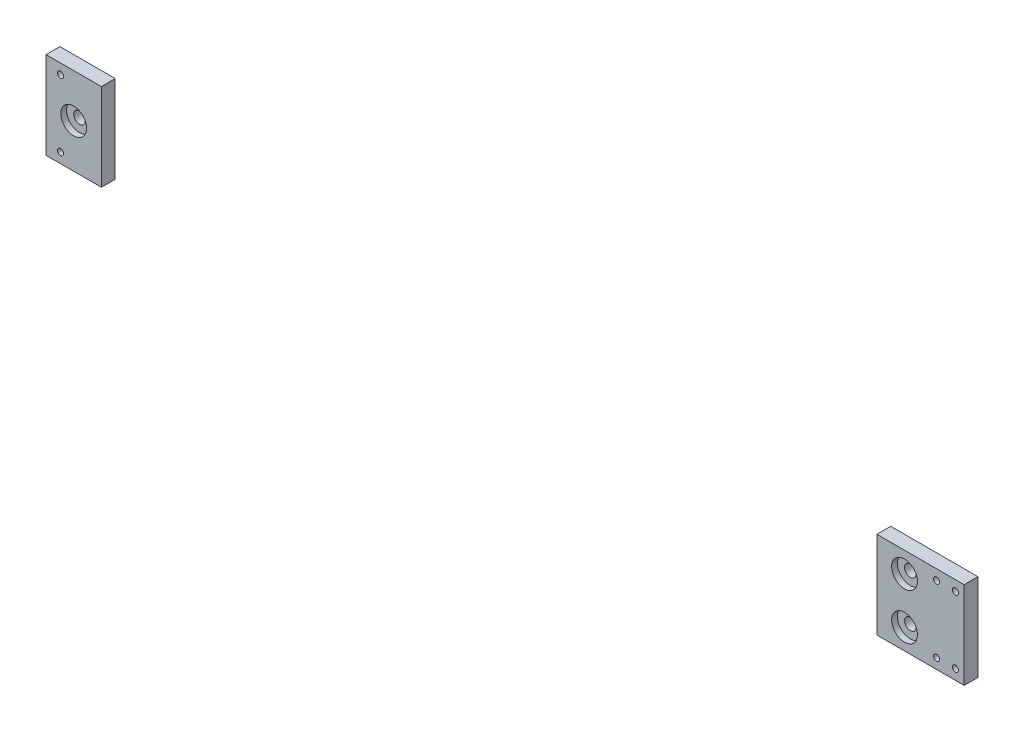
ISO-10303-21;
HEADER;
FILE_DESCRIPTION(('STEP AP214'),'2;1');
FILE_NAME('part.step','',(''),(''),'','','');
FILE_SCHEMA(('AUTOMOTIVE_DESIGN { 1 0 10303 214 1 1 1 1 }'));
ENDSEC;
DATA;
#1=APPLICATION_CONTEXT('core data for automotive mechanical design processes');
#2=APPLICATION_PROTOCOL_DEFINITION('international standard','automotive_design',2000,#1);
#3=PRODUCT_CONTEXT('',#1,'mechanical');
#4=PRODUCT('Part','Part','',(#3));
#5=PRODUCT_RELATED_PRODUCT_CATEGORY('part','',(#4));
#6=PRODUCT_DEFINITION_FORMATION('','',#4);
#7=PRODUCT_DEFINITION_CONTEXT('part definition',#1,'design');
#8=PRODUCT_DEFINITION('design','',#6,#7);
#9=PRODUCT_DEFINITION_SHAPE('','',#8);
#10=(LENGTH_UNIT() NAMED_UNIT(*) SI_UNIT(.MILLI.,.METRE.));
#11=(NAMED_UNIT(*) PLANE_ANGLE_UNIT() SI_UNIT($,.RADIAN.));
#12=(NAMED_UNIT(*) SI_UNIT($,.STERADIAN.) SOLID_ANGLE_UNIT());
#13=UNCERTAINTY_MEASURE_WITH_UNIT(LENGTH_MEASURE(1.E-05),#10,'distance_accuracy_value','');
#14=(GEOMETRIC_REPRESENTATION_CONTEXT(3) GLOBAL_UNCERTAINTY_ASSIGNED_CONTEXT((#13)) GLOBAL_UNIT_ASSIGNED_CONTEXT((#10,
#11,#12)) REPRESENTATION_CONTEXT('',''));
#15=CARTESIAN_POINT('',(0.,0.,0.));
#16=DIRECTION('',(0.,0.,1.));
#17=DIRECTION('',(1.,0.,0.));
#18=AXIS2_PLACEMENT_3D('',#15,#16,#17);
#19=CARTESIAN_POINT('',(295.275,-15.875,0.00102977183991798));
#20=DIRECTION('',(0.,0.,1.));
#21=DIRECTION('',(1.,0.,0.));
#22=AXIS2_PLACEMENT_3D('',#19,#20,#21);
#23=CYLINDRICAL_SURFACE('',#22,3.96875000000005);
#24=CARTESIAN_POINT('',(295.275,-15.875,0.00102977183991798));
#25=DIRECTION('',(0.,0.,1.));
#26=DIRECTION('',(1.,0.,0.));
#27=AXIS2_PLACEMENT_3D('',#24,#25,#26);
#28=CIRCLE('',#27,3.96875000000005);
#29=CARTESIAN_POINT('',(299.24375,-15.875,0.00102977183991798));
#30=VERTEX_POINT('',#29);
#31=EDGE_CURVE('E152',#30,#30,#28,.F.);
#32=CARTESIAN_POINT('',(295.275,-15.875,5.55854977183992));
#33=DIRECTION('',(0.,0.,1.));
#34=DIRECTION('',(1.,0.,0.));
#35=AXIS2_PLACEMENT_3D('',#32,#33,#34);
#36=CIRCLE('',#35,3.96875000000005);
#37=CARTESIAN_POINT('',(299.24375,-15.875,5.55854977183992));
#38=VERTEX_POINT('',#37);
#39=EDGE_CURVE('E158',#38,#38,#36,.F.);
#40=CARTESIAN_POINT('',(299.24375,-15.875,0.00102977183991798));
#41=CARTESIAN_POINT('',(299.24375,-15.875,0.0589206051732512));
#42=CARTESIAN_POINT('',(299.24375,-15.875,0.116811438506585));
#43=CARTESIAN_POINT('',(299.24375,-15.875,0.232593105173251));
#44=CARTESIAN_POINT('',(299.24375,-15.875,0.290483938506585));
#45=CARTESIAN_POINT('',(299.24375,-15.875,0.406265605173251));
#46=CARTESIAN_POINT('',(299.24375,-15.875,0.464156438506585));
#47=CARTESIAN_POINT('',(299.24375,-15.875,0.579938105173251));
#48=CARTESIAN_POINT('',(299.24375,-15.875,0.637828938506585));
#49=CARTESIAN_POINT('',(299.24375,-15.875,0.753610605173251));
#50=CARTESIAN_POINT('',(299.24375,-15.875,0.811501438506585));
#51=CARTESIAN_POINT('',(299.24375,-15.875,0.927283105173251));
#52=CARTESIAN_POINT('',(299.24375,-15.875,0.985173938506585));
#53=CARTESIAN_POINT('',(299.24375,-15.875,1.10095560517325));
#54=CARTESIAN_POINT('',(299.24375,-15.875,1.15884643850658));
#55=CARTESIAN_POINT('',(299.24375,-15.875,1.27462810517325));
#56=CARTESIAN_POINT('',(299.24375,-15.875,1.33251893850658));
#57=CARTESIAN_POINT('',(299.24375,-15.875,1.44830060517325));
#58=CARTESIAN_POINT('',(299.24375,-15.875,1.50619143850658));
#59=CARTESIAN_POINT('',(299.24375,-15.875,1.62197310517325));
#60=CARTESIAN_POINT('',(299.24375,-15.875,1.67986393850658));
#61=CARTESIAN_POINT('',(299.24375,-15.875,1.79564560517325));
#62=CARTESIAN_POINT('',(299.24375,-15.875,1.85353643850658));
#63=CARTESIAN_POINT('',(299.24375,-15.875,1.96931810517325));
#64=CARTESIAN_POINT('',(299.24375,-15.875,2.02720893850658));
#65=CARTESIAN_POINT('',(299.24375,-15.875,2.14299060517325));
#66=CARTESIAN_POINT('',(299.24375,-15.875,2.20088143850658));
#67=CARTESIAN_POINT('',(299.24375,-15.875,2.31666310517325));
#68=CARTESIAN_POINT('',(299.24375,-15.875,2.37455393850658));
#69=CARTESIAN_POINT('',(299.24375,-15.875,2.49033560517325));
#70=CARTESIAN_POINT('',(299.24375,-15.875,2.54822643850658));
#71=CARTESIAN_POINT('',(299.24375,-15.875,2.66400810517325));
#72=CARTESIAN_POINT('',(299.24375,-15.875,2.72189893850658));
#73=CARTESIAN_POINT('',(299.24375,-15.875,2.83768060517325));
#74=CARTESIAN_POINT('',(299.24375,-15.875,2.89557143850658));
#75=CARTESIAN_POINT('',(299.24375,-15.875,3.01135310517325));
#76=CARTESIAN_POINT('',(299.24375,-15.875,3.06924393850658));
#77=CARTESIAN_POINT('',(299.24375,-15.875,3.18502560517325));
#78=CARTESIAN_POINT('',(299.24375,-15.875,3.24291643850658));
#79=CARTESIAN_POINT('',(299.24375,-15.875,3.35869810517325));
#80=CARTESIAN_POINT('',(299.24375,-15.875,3.41658893850658));
#81=CARTESIAN_POINT('',(299.24375,-15.875,3.53237060517325));
#82=CARTESIAN_POINT('',(299.24375,-15.875,3.59026143850658));
#83=CARTESIAN_POINT('',(299.24375,-15.875,3.70604310517325));
#84=CARTESIAN_POINT('',(299.24375,-15.875,3.76393393850658));
#85=CARTESIAN_POINT('',(299.24375,-15.875,3.87971560517325));
#86=CARTESIAN_POINT('',(299.24375,-15.875,3.93760643850658));
#87=CARTESIAN_POINT('',(299.24375,-15.875,4.05338810517325));
#88=CARTESIAN_POINT('',(299.24375,-15.875,4.11127893850658));
#89=CARTESIAN_POINT('',(299.24375,-15.875,4.22706060517325));
#90=CARTESIAN_POINT('',(299.24375,-15.875,4.28495143850658));
#91=CARTESIAN_POINT('',(299.24375,-15.875,4.40073310517325));
#92=CARTESIAN_POINT('',(299.24375,-15.875,4.45862393850658));
#93=CARTESIAN_POINT('',(299.24375,-15.875,4.57440560517325));
#94=CARTESIAN_POINT('',(299.24375,-15.875,4.63229643850658));
#95=CARTESIAN_POINT('',(299.24375,-15.875,4.74807810517325));
#96=CARTESIAN_POINT('',(299.24375,-15.875,4.80596893850658));
#97=CARTESIAN_POINT('',(299.24375,-15.875,4.92175060517325));
#98=CARTESIAN_POINT('',(299.24375,-15.875,4.97964143850658));
#99=CARTESIAN_POINT('',(299.24375,-15.875,5.09542310517325));
#100=CARTESIAN_POINT('',(299.24375,-15.875,5.15331393850658));
#101=CARTESIAN_POINT('',(299.24375,-15.875,5.26909560517325));
#102=CARTESIAN_POINT('',(299.24375,-15.875,5.32698643850658));
#103=CARTESIAN_POINT('',(299.24375,-15.875,5.44276810517325));
#104=CARTESIAN_POINT('',(299.24375,-15.875,5.50065893850658));
#105=CARTESIAN_POINT('',(299.24375,-15.875,5.55854977183992));
#106=B_SPLINE_CURVE_WITH_KNOTS('',3,(#40,#41,#42,#43,#44,#45,#46,#47,#48,#49,#50,#51,#52,#53,
#54,#55,#56,#57,#58,#59,#60,#61,#62,#63,#64,#65,#66,#67,#68,#69,#70,#71,#72,#73,#74,#75,#76,#77,
#78,#79,#80,#81,#82,#83,#84,#85,#86,#87,#88,#89,#90,#91,#92,#93,#94,#95,#96,#97,#98,#99,#100,
#101,#102,#103,#104,#105),.UNSPECIFIED.,.F.,.F.,(4,2,2,2,2,2,2,2,2,2,2,2,2,2,2,2,2,2,2,2,2,2,2,
2,2,2,2,2,2,2,2,2,4),(0.,0.1736725,0.347345,0.5210175,0.69469,0.8683625,1.042035,1.2157075,
1.38938,1.5630525,1.736725,1.9103975,2.08407,2.2577425,2.431415,2.6050875,2.77876,2.9524325,
3.126105,3.2997775,3.47345,3.6471225,3.820795,3.9944675,4.16814,4.3418125,4.515485,4.6891575,
4.86283,5.0365025,5.210175,5.3838475,5.55752),.UNSPECIFIED.);
#107=EDGE_CURVE('BSEAM55',#30,#38,#106,.T.);
#108=ORIENTED_EDGE('',*,*,#31,.T.);
#109=ORIENTED_EDGE('',*,*,#39,.F.);
#110=ORIENTED_EDGE('',*,*,#107,.T.);
#111=ORIENTED_EDGE('',*,*,#107,.F.);
#112=EDGE_LOOP('',(#108,#110,#109,#111));
#113=FACE_BOUND('',#112,.T.);
#114=ADVANCED_FACE('F55',(#113),#23,.F.);
#115=CARTESIAN_POINT('',(295.275,15.875,0.00102977183991798));
#116=DIRECTION('',(0.,0.,1.));
#117=DIRECTION('',(1.,0.,0.));
#118=AXIS2_PLACEMENT_3D('',#115,#116,#117);
#119=CYLINDRICAL_SURFACE('',#118,3.96875000000005);
#120=CARTESIAN_POINT('',(295.275,15.875,0.00102977183991798));
#121=DIRECTION('',(0.,0.,1.));
#122=DIRECTION('',(1.,0.,0.));
#123=AXIS2_PLACEMENT_3D('',#120,#121,#122);
#124=CIRCLE('',#123,3.96875000000005);
#125=CARTESIAN_POINT('',(299.24375,15.875,0.00102977183991798));
#126=VERTEX_POINT('',#125);
#127=EDGE_CURVE('E141',#126,#126,#124,.T.);
#128=CARTESIAN_POINT('',(295.275,15.875,5.55854977183992));
#129=DIRECTION('',(0.,0.,1.));
#130=DIRECTION('',(1.,0.,0.));
#131=AXIS2_PLACEMENT_3D('',#128,#129,#130);
#132=CIRCLE('',#131,3.96875000000005);
#133=CARTESIAN_POINT('',(299.24375,15.875,5.55854977183992));
#134=VERTEX_POINT('',#133);
#135=EDGE_CURVE('E155',#134,#134,#132,.F.);
#136=CARTESIAN_POINT('',(299.24375,15.875,0.00102977183991798));
#137=CARTESIAN_POINT('',(299.24375,15.875,0.0589206051732512));
#138=CARTESIAN_POINT('',(299.24375,15.875,0.116811438506585));
#139=CARTESIAN_POINT('',(299.24375,15.875,0.232593105173251));
#140=CARTESIAN_POINT('',(299.24375,15.875,0.290483938506585));
#141=CARTESIAN_POINT('',(299.24375,15.875,0.406265605173251));
#142=CARTESIAN_POINT('',(299.24375,15.875,0.464156438506585));
#143=CARTESIAN_POINT('',(299.24375,15.875,0.579938105173251));
#144=CARTESIAN_POINT('',(299.24375,15.875,0.637828938506585));
#145=CARTESIAN_POINT('',(299.24375,15.875,0.753610605173251));
#146=CARTESIAN_POINT('',(299.24375,15.875,0.811501438506585));
#147=CARTESIAN_POINT('',(299.24375,15.875,0.927283105173251));
#148=CARTESIAN_POINT('',(299.24375,15.875,0.985173938506585));
#149=CARTESIAN_POINT('',(299.24375,15.875,1.10095560517325));
#150=CARTESIAN_POINT('',(299.24375,15.875,1.15884643850658));
#151=CARTESIAN_POINT('',(299.24375,15.875,1.27462810517325));
#152=CARTESIAN_POINT('',(299.24375,15.875,1.33251893850658));
#153=CARTESIAN_POINT('',(299.24375,15.875,1.44830060517325));
#154=CARTESIAN_POINT('',(299.24375,15.875,1.50619143850658));
#155=CARTESIAN_POINT('',(299.24375,15.875,1.62197310517325));
#156=CARTESIAN_POINT('',(299.24375,15.875,1.67986393850658));
#157=CARTESIAN_POINT('',(299.24375,15.875,1.79564560517325));
#158=CARTESIAN_POINT('',(299.24375,15.875,1.85353643850658));
#159=CARTESIAN_POINT('',(299.24375,15.875,1.96931810517325));
#160=CARTESIAN_POINT('',(299.24375,15.875,2.02720893850658));
#161=CARTESIAN_POINT('',(299.24375,15.875,2.14299060517325));
#162=CARTESIAN_POINT('',(299.24375,15.875,2.20088143850658));
#163=CARTESIAN_POINT('',(299.24375,15.875,2.31666310517325));
#164=CARTESIAN_POINT('',(299.24375,15.875,2.37455393850658));
#165=CARTESIAN_POINT('',(299.24375,15.875,2.49033560517325));
#166=CARTESIAN_POINT('',(299.24375,15.875,2.54822643850658));
#167=CARTESIAN_POINT('',(299.24375,15.875,2.66400810517325));
#168=CARTESIAN_POINT('',(299.24375,15.875,2.72189893850658));
#169=CARTESIAN_POINT('',(299.24375,15.875,2.83768060517325));
#170=CARTESIAN_POINT('',(299.24375,15.875,2.89557143850658));
#171=CARTESIAN_POINT('',(299.24375,15.875,3.01135310517325));
#172=CARTESIAN_POINT('',(299.24375,15.875,3.06924393850658));
#173=CARTESIAN_POINT('',(299.24375,15.875,3.18502560517325));
#174=CARTESIAN_POINT('',(299.24375,15.875,3.24291643850658));
#175=CARTESIAN_POINT('',(299.24375,15.875,3.35869810517325));
#176=CARTESIAN_POINT('',(299.24375,15.875,3.41658893850658));
#177=CARTESIAN_POINT('',(299.24375,15.875,3.53237060517325));
#178=CARTESIAN_POINT('',(299.24375,15.875,3.59026143850658));
#179=CARTESIAN_POINT('',(299.24375,15.875,3.70604310517325));
#180=CARTESIAN_POINT('',(299.24375,15.875,3.76393393850658));
#181=CARTESIAN_POINT('',(299.24375,15.875,3.87971560517325));
#182=CARTESIAN_POINT('',(299.24375,15.875,3.93760643850658));
#183=CARTESIAN_POINT('',(299.24375,15.875,4.05338810517325));
#184=CARTESIAN_POINT('',(299.24375,15.875,4.11127893850658));
#185=CARTESIAN_POINT('',(299.24375,15.875,4.22706060517325));
#186=CARTESIAN_POINT('',(299.24375,15.875,4.28495143850658));
#187=CARTESIAN_POINT('',(299.24375,15.875,4.40073310517325));
#188=CARTESIAN_POINT('',(299.24375,15.875,4.45862393850658));
#189=CARTESIAN_POINT('',(299.24375,15.875,4.57440560517325));
#190=CARTESIAN_POINT('',(299.24375,15.875,4.63229643850658));
#191=CARTESIAN_POINT('',(299.24375,15.875,4.74807810517325));
#192=CARTESIAN_POINT('',(299.24375,15.875,4.80596893850658));
#193=CARTESIAN_POINT('',(299.24375,15.875,4.92175060517325));
#194=CARTESIAN_POINT('',(299.24375,15.875,4.97964143850658));
#195=CARTESIAN_POINT('',(299.24375,15.875,5.09542310517325));
#196=CARTESIAN_POINT('',(299.24375,15.875,5.15331393850658));
#197=CARTESIAN_POINT('',(299.24375,15.875,5.26909560517325));
#198=CARTESIAN_POINT('',(299.24375,15.875,5.32698643850658));
#199=CARTESIAN_POINT('',(299.24375,15.875,5.44276810517325));
#200=CARTESIAN_POINT('',(299.24375,15.875,5.50065893850658));
#201=CARTESIAN_POINT('',(299.24375,15.875,5.55854977183992));
#202=B_SPLINE_CURVE_WITH_KNOTS('',3,(#136,#137,#138,#139,#140,#141,#142,#143,#144,#145,#146,
#147,#148,#149,#150,#151,#152,#153,#154,#155,#156,#157,#158,#159,#160,#161,#162,#163,#164,#165,
#166,#167,#168,#169,#170,#171,#172,#173,#174,#175,#176,#177,#178,#179,#180,#181,#182,#183,#184,
#185,#186,#187,#188,#189,#190,#191,#192,#193,#194,#195,#196,#197,#198,#199,#200,#201),
.UNSPECIFIED.,.F.,.F.,(4,2,2,2,2,2,2,2,2,2,2,2,2,2,2,2,2,2,2,2,2,2,2,2,2,2,2,2,2,2,2,2,4),(0.,
0.1736725,0.347345,0.5210175,0.69469,0.8683625,1.042035,1.2157075,1.38938,1.5630525,1.736725,
1.9103975,2.08407,2.2577425,2.431415,2.6050875,2.77876,2.9524325,3.126105,3.2997775,3.47345,
3.6471225,3.820795,3.9944675,4.16814,4.3418125,4.515485,4.6891575,4.86283,5.0365025,5.210175,
5.3838475,5.55752),.UNSPECIFIED.);
#203=EDGE_CURVE('BSEAM189',#126,#134,#202,.T.);
#204=ORIENTED_EDGE('',*,*,#127,.F.);
#205=ORIENTED_EDGE('',*,*,#135,.F.);
#206=ORIENTED_EDGE('',*,*,#203,.T.);
#207=ORIENTED_EDGE('',*,*,#203,.F.);
#208=EDGE_LOOP('',(#204,#206,#205,#207));
#209=FACE_BOUND('',#208,.T.);
#210=ADVANCED_FACE('F189',(#209),#119,.F.);
#211=CARTESIAN_POINT('',(0.,0.,0.00102977183991798));
#212=DIRECTION('',(0.,0.,1.));
#213=DIRECTION('',(1.,0.,0.));
#214=AXIS2_PLACEMENT_3D('',#211,#212,#213);
#215=PLANE('',#214);
#216=DIRECTION('',(1.,0.,0.));
#217=VECTOR('',#216,1.);
#218=CARTESIAN_POINT('',(0.,29.9999999999998,0.00102977183991798));
#219=LINE('',#218,#217);
#220=CARTESIAN_POINT('',(276.236980653398,30.,0.00102977183991798));
#221=VERTEX_POINT('',#220);
#222=CARTESIAN_POINT('',(336.274999942,30.,0.00102977183991798));
#223=VERTEX_POINT('',#222);
#224=EDGE_CURVE('E111',#221,#223,#219,.T.);
#225=ORIENTED_EDGE('',*,*,#224,.T.);
#226=DIRECTION('',(0.,-1.,0.));
#227=VECTOR('',#226,1.);
#228=CARTESIAN_POINT('',(336.274999942,30.,0.00102977183991798));
#229=LINE('',#228,#227);
#230=CARTESIAN_POINT('',(336.274999942,-29.9999999999999,0.00102977183991798));
#231=VERTEX_POINT('',#230);
#232=EDGE_CURVE('E70',#223,#231,#229,.T.);
#233=ORIENTED_EDGE('',*,*,#232,.T.);
#234=DIRECTION('',(1.,0.,0.));
#235=VECTOR('',#234,1.);
#236=CARTESIAN_POINT('',(0.,-30.,0.00102977183991798));
#237=LINE('',#236,#235);
#238=CARTESIAN_POINT('',(276.236980653398,-30.,0.00102977183991798));
#239=VERTEX_POINT('',#238);
#240=EDGE_CURVE('E109',#239,#231,#237,.T.);
#241=ORIENTED_EDGE('',*,*,#240,.F.);
#242=DIRECTION('',(0.,-1.,0.));
#243=VECTOR('',#242,1.);
#244=CARTESIAN_POINT('',(276.236980653398,0.,0.00102977183991798));
#245=LINE('',#244,#243);
#246=EDGE_CURVE('E114',#221,#239,#245,.T.);
#247=ORIENTED_EDGE('',*,*,#246,.F.);
#248=EDGE_LOOP('',(#225,#233,#241,#247));
#249=FACE_BOUND('',#248,.T.);
#250=CARTESIAN_POINT('',(317.274999942,23.,0.00102977183991798));
#251=DIRECTION('',(0.,0.,1.));
#252=DIRECTION('',(1.,0.,0.));
#253=AXIS2_PLACEMENT_3D('',#250,#251,#252);
#254=CIRCLE('',#253,2.09999999999999);
#255=CARTESIAN_POINT('',(319.374999942,23.,0.00102977183991798));
#256=VERTEX_POINT('',#255);
#257=EDGE_CURVE('E127',#256,#256,#254,.F.);
#258=ORIENTED_EDGE('',*,*,#257,.F.);
#259=EDGE_LOOP('',(#258));
#260=FACE_BOUND('',#259,.T.);
#261=CARTESIAN_POINT('',(330.274999942,23.,0.00102977183991798));
#262=DIRECTION('',(0.,0.,1.));
#263=DIRECTION('',(1.,0.,0.));
#264=AXIS2_PLACEMENT_3D('',#261,#262,#263);
#265=CIRCLE('',#264,2.09999999999999);
#266=CARTESIAN_POINT('',(332.374999942,23.,0.00102977183991798));
#267=VERTEX_POINT('',#266);
#268=EDGE_CURVE('E145',#267,#267,#265,.F.);
#269=ORIENTED_EDGE('',*,*,#268,.F.);
#270=EDGE_LOOP('',(#269));
#271=FACE_BOUND('',#270,.T.);
#272=CARTESIAN_POINT('',(330.274999942,-23.,0.00102977183991798));
#273=DIRECTION('',(0.,0.,1.));
#274=DIRECTION('',(1.,0.,0.));
#275=AXIS2_PLACEMENT_3D('',#272,#273,#274);
#276=CIRCLE('',#275,2.09999999999999);
#277=CARTESIAN_POINT('',(332.374999942,-23.,0.00102977183991798));
#278=VERTEX_POINT('',#277);
#279=EDGE_CURVE('E137',#278,#278,#276,.F.);
#280=ORIENTED_EDGE('',*,*,#279,.F.);
#281=EDGE_LOOP('',(#280));
#282=FACE_BOUND('',#281,.T.);
#283=CARTESIAN_POINT('',(317.274999942,-23.,0.00102977183991798));
#284=DIRECTION('',(0.,0.,1.));
#285=DIRECTION('',(1.,0.,0.));
#286=AXIS2_PLACEMENT_3D('',#283,#284,#285);
#287=CIRCLE('',#286,2.09999999999999);
#288=CARTESIAN_POINT('',(319.374999942,-23.,0.00102977183991798));
#289=VERTEX_POINT('',#288);
#290=EDGE_CURVE('E138',#289,#289,#287,.F.);
#291=ORIENTED_EDGE('',*,*,#290,.F.);
#292=EDGE_LOOP('',(#291));
#293=FACE_BOUND('',#292,.T.);
#294=ORIENTED_EDGE('',*,*,#31,.F.);
#295=EDGE_LOOP('',(#294));
#296=FACE_BOUND('',#295,.T.);
#297=ORIENTED_EDGE('',*,*,#127,.T.);
#298=EDGE_LOOP('',(#297));
#299=FACE_BOUND('',#298,.T.);
#300=ADVANCED_FACE('F107',(#249,#260,#271,#282,#293,#296,#299),#215,.F.);
#301=CARTESIAN_POINT('',(0.,0.,9.52602977183992));
#302=DIRECTION('',(0.,0.,1.));
#303=DIRECTION('',(1.,0.,0.));
#304=AXIS2_PLACEMENT_3D('',#301,#302,#303);
#305=PLANE('',#304);
#306=DIRECTION('',(0.,-1.,0.));
#307=VECTOR('',#306,1.);
#308=CARTESIAN_POINT('',(336.274999942,30.,9.52602977183992));
#309=LINE('',#308,#307);
#310=CARTESIAN_POINT('',(336.274999942,30.,9.52602977183992));
#311=VERTEX_POINT('',#310);
#312=CARTESIAN_POINT('',(336.274999942,-29.9999999999999,9.52602977183992));
#313=VERTEX_POINT('',#312);
#314=EDGE_CURVE('E97',#311,#313,#309,.T.);
#315=ORIENTED_EDGE('',*,*,#314,.F.);
#316=DIRECTION('',(1.,0.,0.));
#317=VECTOR('',#316,1.);
#318=CARTESIAN_POINT('',(0.,29.9999999999998,9.52602977183992));
#319=LINE('',#318,#317);
#320=CARTESIAN_POINT('',(276.236980653398,30.,9.52602977183992));
#321=VERTEX_POINT('',#320);
#322=EDGE_CURVE('E117',#321,#311,#319,.T.);
#323=ORIENTED_EDGE('',*,*,#322,.F.);
#324=DIRECTION('',(0.,-1.,0.));
#325=VECTOR('',#324,1.);
#326=CARTESIAN_POINT('',(276.236980653398,0.,9.52602977183992));
#327=LINE('',#326,#325);
#328=CARTESIAN_POINT('',(276.236980653398,-30.,9.52602977183992));
#329=VERTEX_POINT('',#328);
#330=EDGE_CURVE('E124',#321,#329,#327,.T.);
#331=ORIENTED_EDGE('',*,*,#330,.T.);
#332=DIRECTION('',(1.,0.,0.));
#333=VECTOR('',#332,1.);
#334=CARTESIAN_POINT('',(0.,-30.,9.52602977183992));
#335=LINE('',#334,#333);
#336=EDGE_CURVE('E122',#329,#313,#335,.T.);
#337=ORIENTED_EDGE('',*,*,#336,.T.);
#338=EDGE_LOOP('',(#315,#323,#331,#337));
#339=FACE_BOUND('',#338,.T.);
#340=CARTESIAN_POINT('',(295.275,15.875,9.52602977183992));
#341=DIRECTION('',(0.,0.,1.));
#342=DIRECTION('',(1.,0.,0.));
#343=AXIS2_PLACEMENT_3D('',#340,#341,#342);
#344=CIRCLE('',#343,8.89000000000001);
#345=CARTESIAN_POINT('',(304.165,15.875,9.52602977183992));
#346=VERTEX_POINT('',#345);
#347=EDGE_CURVE('E161',#346,#346,#344,.T.);
#348=ORIENTED_EDGE('',*,*,#347,.F.);
#349=EDGE_LOOP('',(#348));
#350=FACE_BOUND('',#349,.T.);
#351=CARTESIAN_POINT('',(295.275,-15.875,9.52602977183992));
#352=DIRECTION('',(0.,0.,1.));
#353=DIRECTION('',(-1.,0.,0.));
#354=AXIS2_PLACEMENT_3D('',#351,#352,#353);
#355=CIRCLE('',#354,8.89000000000001);
#356=CARTESIAN_POINT('',(286.385,-15.875,9.52602977183992));
#357=VERTEX_POINT('',#356);
#358=EDGE_CURVE('E102',#357,#357,#355,.T.);
#359=ORIENTED_EDGE('',*,*,#358,.F.);
#360=EDGE_LOOP('',(#359));
#361=FACE_BOUND('',#360,.T.);
#362=CARTESIAN_POINT('',(317.274999942,-23.,9.52602977183992));
#363=DIRECTION('',(0.,0.,1.));
#364=DIRECTION('',(1.,0.,0.));
#365=AXIS2_PLACEMENT_3D('',#362,#363,#364);
#366=CIRCLE('',#365,2.09999999999999);
#367=CARTESIAN_POINT('',(319.374999942,-23.,9.52602977183992));
#368=VERTEX_POINT('',#367);
#369=EDGE_CURVE('E134',#368,#368,#366,.T.);
#370=ORIENTED_EDGE('',*,*,#369,.F.);
#371=EDGE_LOOP('',(#370));
#372=FACE_BOUND('',#371,.T.);
#373=CARTESIAN_POINT('',(330.274999942,-23.,9.52602977183992));
#374=DIRECTION('',(0.,0.,1.));
#375=DIRECTION('',(1.,0.,0.));
#376=AXIS2_PLACEMENT_3D('',#373,#374,#375);
#377=CIRCLE('',#376,2.09999999999999);
#378=CARTESIAN_POINT('',(332.374999942,-23.,9.52602977183992));
#379=VERTEX_POINT('',#378);
#380=EDGE_CURVE('E142',#379,#379,#377,.T.);
#381=ORIENTED_EDGE('',*,*,#380,.F.);
#382=EDGE_LOOP('',(#381));
#383=FACE_BOUND('',#382,.T.);
#384=CARTESIAN_POINT('',(330.274999942,23.,9.52602977183992));
#385=DIRECTION('',(0.,0.,1.));
#386=DIRECTION('',(1.,0.,0.));
#387=AXIS2_PLACEMENT_3D('',#384,#385,#386);
#388=CIRCLE('',#387,2.09999999999999);
#389=CARTESIAN_POINT('',(332.374999942,23.,9.52602977183992));
#390=VERTEX_POINT('',#389);
#391=EDGE_CURVE('E133',#390,#390,#388,.T.);
#392=ORIENTED_EDGE('',*,*,#391,.F.);
#393=EDGE_LOOP('',(#392));
#394=FACE_BOUND('',#393,.T.);
#395=CARTESIAN_POINT('',(317.274999942,23.,9.52602977183992));
#396=DIRECTION('',(0.,0.,1.));
#397=DIRECTION('',(1.,0.,0.));
#398=AXIS2_PLACEMENT_3D('',#395,#396,#397);
#399=CIRCLE('',#398,2.09999999999999);
#400=CARTESIAN_POINT('',(319.374999942,23.,9.52602977183992));
#401=VERTEX_POINT('',#400);
#402=EDGE_CURVE('E130',#401,#401,#399,.T.);
#403=ORIENTED_EDGE('',*,*,#402,.F.);
#404=EDGE_LOOP('',(#403));
#405=FACE_BOUND('',#404,.T.);
#406=ADVANCED_FACE('F178',(#339,#350,#361,#372,#383,#394,#405),#305,.T.);
#407=CARTESIAN_POINT('',(276.236980653398,0.,5.55854977183992));
#408=DIRECTION('',(1.,0.,0.));
#409=DIRECTION('',(0.,0.,-1.));
#410=AXIS2_PLACEMENT_3D('',#407,#408,#409);
#411=PLANE('',#410);
#412=ORIENTED_EDGE('',*,*,#246,.T.);
#413=DIRECTION('',(0.,0.,-1.));
#414=VECTOR('',#413,1.);
#415=CARTESIAN_POINT('',(276.236980653398,-30.,5.55854977183992));
#416=LINE('',#415,#414);
#417=EDGE_CURVE('E13',#329,#239,#416,.T.);
#418=ORIENTED_EDGE('',*,*,#417,.F.);
#419=ORIENTED_EDGE('',*,*,#330,.F.);
#420=DIRECTION('',(0.,0.,-1.));
#421=VECTOR('',#420,1.);
#422=CARTESIAN_POINT('',(276.236980653398,30.,5.55854977183992));
#423=LINE('',#422,#421);
#424=EDGE_CURVE('E63',#321,#221,#423,.T.);
#425=ORIENTED_EDGE('',*,*,#424,.T.);
#426=EDGE_LOOP('',(#412,#418,#419,#425));
#427=FACE_BOUND('',#426,.T.);
#428=ADVANCED_FACE('F57',(#427),#411,.F.);
#429=CARTESIAN_POINT('',(0.,-30.,5.55854977183992));
#430=DIRECTION('',(0.,1.,0.));
#431=DIRECTION('',(-1.,0.,0.));
#432=AXIS2_PLACEMENT_3D('',#429,#430,#431);
#433=PLANE('',#432);
#434=ORIENTED_EDGE('',*,*,#240,.T.);
#435=DIRECTION('',(0.,0.,1.));
#436=VECTOR('',#435,1.);
#437=CARTESIAN_POINT('',(336.274999942,-29.9999999999999,0.00102977183991798));
#438=LINE('',#437,#436);
#439=EDGE_CURVE('E94',#231,#313,#438,.T.);
#440=ORIENTED_EDGE('',*,*,#439,.T.);
#441=ORIENTED_EDGE('',*,*,#336,.F.);
#442=ORIENTED_EDGE('',*,*,#417,.T.);
#443=EDGE_LOOP('',(#434,#440,#441,#442));
#444=FACE_BOUND('',#443,.T.);
#445=ADVANCED_FACE('F113',(#444),#433,.F.);
#446=CARTESIAN_POINT('',(0.,29.9999999999998,5.55854977183992));
#447=DIRECTION('',(0.,1.,0.));
#448=DIRECTION('',(-1.,0.,0.));
#449=AXIS2_PLACEMENT_3D('',#446,#447,#448);
#450=PLANE('',#449);
#451=DIRECTION('',(0.,0.,1.));
#452=VECTOR('',#451,1.);
#453=CARTESIAN_POINT('',(336.274999942,30.,0.00102977183991798));
#454=LINE('',#453,#452);
#455=EDGE_CURVE('E103',#223,#311,#454,.T.);
#456=ORIENTED_EDGE('',*,*,#455,.F.);
#457=ORIENTED_EDGE('',*,*,#224,.F.);
#458=ORIENTED_EDGE('',*,*,#424,.F.);
#459=ORIENTED_EDGE('',*,*,#322,.T.);
#460=EDGE_LOOP('',(#456,#457,#458,#459));
#461=FACE_BOUND('',#460,.T.);
#462=ADVANCED_FACE('F180',(#461),#450,.T.);
#463=CARTESIAN_POINT('',(317.274999942,23.,-5.93866719012705));
#464=DIRECTION('',(0.,0.,1.));
#465=DIRECTION('',(1.,0.,0.));
#466=AXIS2_PLACEMENT_3D('',#463,#464,#465);
#467=CYLINDRICAL_SURFACE('',#466,2.09999999999999);
#468=ORIENTED_EDGE('',*,*,#257,.T.);
#469=EDGE_LOOP('',(#468));
#470=FACE_BOUND('',#469,.T.);
#471=ORIENTED_EDGE('',*,*,#402,.T.);
#472=EDGE_LOOP('',(#471));
#473=FACE_BOUND('',#472,.T.);
#474=ADVANCED_FACE('F205',(#470,#473),#467,.F.);
#475=CARTESIAN_POINT('',(330.274999942,23.,-5.93866719012705));
#476=DIRECTION('',(0.,0.,1.));
#477=DIRECTION('',(1.,0.,0.));
#478=AXIS2_PLACEMENT_3D('',#475,#476,#477);
#479=CYLINDRICAL_SURFACE('',#478,2.09999999999999);
#480=ORIENTED_EDGE('',*,*,#268,.T.);
#481=EDGE_LOOP('',(#480));
#482=FACE_BOUND('',#481,.T.);
#483=ORIENTED_EDGE('',*,*,#391,.T.);
#484=EDGE_LOOP('',(#483));
#485=FACE_BOUND('',#484,.T.);
#486=ADVANCED_FACE('F201',(#482,#485),#479,.F.);
#487=CARTESIAN_POINT('',(330.274999942,-23.,-5.93866719012705));
#488=DIRECTION('',(0.,0.,1.));
#489=DIRECTION('',(1.,0.,0.));
#490=AXIS2_PLACEMENT_3D('',#487,#488,#489);
#491=CYLINDRICAL_SURFACE('',#490,2.09999999999999);
#492=ORIENTED_EDGE('',*,*,#279,.T.);
#493=EDGE_LOOP('',(#492));
#494=FACE_BOUND('',#493,.T.);
#495=ORIENTED_EDGE('',*,*,#380,.T.);
#496=EDGE_LOOP('',(#495));
#497=FACE_BOUND('',#496,.T.);
#498=ADVANCED_FACE('F204',(#494,#497),#491,.F.);
#499=CARTESIAN_POINT('',(317.274999942,-23.,-5.93866719012705));
#500=DIRECTION('',(0.,0.,1.));
#501=DIRECTION('',(1.,0.,0.));
#502=AXIS2_PLACEMENT_3D('',#499,#500,#501);
#503=CYLINDRICAL_SURFACE('',#502,2.09999999999999);
#504=ORIENTED_EDGE('',*,*,#290,.T.);
#505=EDGE_LOOP('',(#504));
#506=FACE_BOUND('',#505,.T.);
#507=ORIENTED_EDGE('',*,*,#369,.T.);
#508=EDGE_LOOP('',(#507));
#509=FACE_BOUND('',#508,.T.);
#510=ADVANCED_FACE('F209',(#506,#509),#503,.F.);
#511=CARTESIAN_POINT('',(295.275,15.875,-25.1436873671537));
#512=DIRECTION('',(0.,0.,1.));
#513=DIRECTION('',(1.,0.,0.));
#514=AXIS2_PLACEMENT_3D('',#511,#512,#513);
#515=CYLINDRICAL_SURFACE('',#514,8.89000000000001);
#516=CARTESIAN_POINT('',(295.275,15.875,5.55854977183992));
#517=DIRECTION('',(0.,0.,1.));
#518=DIRECTION('',(1.,0.,0.));
#519=AXIS2_PLACEMENT_3D('',#516,#517,#518);
#520=CIRCLE('',#519,8.89000000000001);
#521=CARTESIAN_POINT('',(304.165,15.875,5.55854977183992));
#522=VERTEX_POINT('',#521);
#523=EDGE_CURVE('E169',#522,#522,#520,.F.);
#524=ORIENTED_EDGE('',*,*,#523,.T.);
#525=EDGE_LOOP('',(#524));
#526=FACE_BOUND('',#525,.T.);
#527=ORIENTED_EDGE('',*,*,#347,.T.);
#528=EDGE_LOOP('',(#527));
#529=FACE_BOUND('',#528,.T.);
#530=ADVANCED_FACE('F212',(#526,#529),#515,.F.);
#531=CARTESIAN_POINT('',(0.,0.,5.55854977183992));
#532=DIRECTION('',(0.,0.,1.));
#533=DIRECTION('',(1.,0.,0.));
#534=AXIS2_PLACEMENT_3D('',#531,#532,#533);
#535=PLANE('',#534);
#536=ORIENTED_EDGE('',*,*,#523,.F.);
#537=EDGE_LOOP('',(#536));
#538=FACE_BOUND('',#537,.T.);
#539=ORIENTED_EDGE('',*,*,#135,.T.);
#540=EDGE_LOOP('',(#539));
#541=FACE_BOUND('',#540,.T.);
#542=ADVANCED_FACE('F252',(#538,#541),#535,.T.);
#543=CARTESIAN_POINT('',(295.275,-15.875,-25.1436873671537));
#544=DIRECTION('',(0.,0.,1.));
#545=DIRECTION('',(1.,0.,0.));
#546=AXIS2_PLACEMENT_3D('',#543,#544,#545);
#547=CYLINDRICAL_SURFACE('',#546,8.89000000000001);
#548=CARTESIAN_POINT('',(295.275,-15.875,5.55854977183992));
#549=DIRECTION('',(0.,0.,1.));
#550=DIRECTION('',(1.,0.,0.));
#551=AXIS2_PLACEMENT_3D('',#548,#549,#550);
#552=CIRCLE('',#551,8.89000000000001);
#553=CARTESIAN_POINT('',(304.165,-15.875,5.55854977183992));
#554=VERTEX_POINT('',#553);
#555=EDGE_CURVE('E162',#554,#554,#552,.F.);
#556=ORIENTED_EDGE('',*,*,#555,.T.);
#557=EDGE_LOOP('',(#556));
#558=FACE_BOUND('',#557,.T.);
#559=ORIENTED_EDGE('',*,*,#358,.T.);
#560=EDGE_LOOP('',(#559));
#561=FACE_BOUND('',#560,.T.);
#562=ADVANCED_FACE('F242',(#558,#561),#547,.F.);
#563=CARTESIAN_POINT('',(0.,0.,5.55854977183992));
#564=DIRECTION('',(0.,0.,1.));
#565=DIRECTION('',(1.,0.,0.));
#566=AXIS2_PLACEMENT_3D('',#563,#564,#565);
#567=PLANE('',#566);
#568=ORIENTED_EDGE('',*,*,#555,.F.);
#569=EDGE_LOOP('',(#568));
#570=FACE_BOUND('',#569,.T.);
#571=ORIENTED_EDGE('',*,*,#39,.T.);
#572=EDGE_LOOP('',(#571));
#573=FACE_BOUND('',#572,.T.);
#574=ADVANCED_FACE('F230',(#570,#573),#567,.T.);
#575=CARTESIAN_POINT('',(336.274999942,30.,0.00102977183991798));
#576=DIRECTION('',(-1.,0.,0.));
#577=DIRECTION('',(0.,0.,1.));
#578=AXIS2_PLACEMENT_3D('',#575,#576,#577);
#579=PLANE('',#578);
#580=ORIENTED_EDGE('',*,*,#314,.T.);
#581=ORIENTED_EDGE('',*,*,#439,.F.);
#582=ORIENTED_EDGE('',*,*,#232,.F.);
#583=ORIENTED_EDGE('',*,*,#455,.T.);
#584=EDGE_LOOP('',(#580,#581,#582,#583));
#585=FACE_BOUND('',#584,.T.);
#586=ADVANCED_FACE('F95',(#585),#579,.F.);
#587=CLOSED_SHELL('',(#114,#210,#300,#406,#428,#445,#462,#474,#486,#498,#510,#530,#542,#562,
#574,#586));
#588=MANIFOLD_SOLID_BREP('B2',#587);
#589=CARTESIAN_POINT('',(0.,-29.9999999999999,5.55854977183992));
#590=DIRECTION('',(0.,1.,0.));
#591=DIRECTION('',(-1.,0.,0.));
#592=AXIS2_PLACEMENT_3D('',#589,#590,#591);
#593=PLANE('',#592);
#594=DIRECTION('',(1.,0.,0.));
#595=VECTOR('',#594,1.);
#596=CARTESIAN_POINT('',(0.,-29.9999999999999,0.00102977183991798));
#597=LINE('',#596,#595);
#598=CARTESIAN_POINT('',(-295.275,-30.,0.00102977183991798));
#599=VERTEX_POINT('',#598);
#600=CARTESIAN_POINT('',(-257.175,-30.,0.00102977183991798));
#601=VERTEX_POINT('',#600);
#602=EDGE_CURVE('E431',#599,#601,#597,.T.);
#603=ORIENTED_EDGE('',*,*,#602,.T.);
#604=DIRECTION('',(0.,0.,-1.));
#605=VECTOR('',#604,1.);
#606=CARTESIAN_POINT('',(-257.175,-30.,5.55854977183992));
#607=LINE('',#606,#605);
#608=CARTESIAN_POINT('',(-257.175,-30.,9.52602977183992));
#609=VERTEX_POINT('',#608);
#610=EDGE_CURVE('E389',#609,#601,#607,.T.);
#611=ORIENTED_EDGE('',*,*,#610,.F.);
#612=DIRECTION('',(1.,0.,0.));
#613=VECTOR('',#612,1.);
#614=CARTESIAN_POINT('',(0.,-29.9999999999999,9.52602977183992));
#615=LINE('',#614,#613);
#616=CARTESIAN_POINT('',(-295.275,-30.,9.52602977183992));
#617=VERTEX_POINT('',#616);
#618=EDGE_CURVE('E429',#617,#609,#615,.T.);
#619=ORIENTED_EDGE('',*,*,#618,.F.);
#620=DIRECTION('',(0.,0.,-1.));
#621=VECTOR('',#620,1.);
#622=CARTESIAN_POINT('',(-295.275,-30.,5.55854977183992));
#623=LINE('',#622,#621);
#624=EDGE_CURVE('E401',#617,#599,#623,.T.);
#625=ORIENTED_EDGE('',*,*,#624,.T.);
#626=EDGE_LOOP('',(#603,#611,#619,#625));
#627=FACE_BOUND('',#626,.T.);
#628=ADVANCED_FACE('F386',(#627),#593,.F.);
#629=CARTESIAN_POINT('',(-257.175,0.,5.55854977183992));
#630=DIRECTION('',(-1.,0.,0.));
#631=DIRECTION('',(0.,0.,1.));
#632=AXIS2_PLACEMENT_3D('',#629,#630,#631);
#633=PLANE('',#632);
#634=DIRECTION('',(0.,1.,0.));
#635=VECTOR('',#634,1.);
#636=CARTESIAN_POINT('',(-257.175,0.,0.00102977183991798));
#637=LINE('',#636,#635);
#638=CARTESIAN_POINT('',(-257.175,30.,0.00102977183991798));
#639=VERTEX_POINT('',#638);
#640=EDGE_CURVE('E459',#601,#639,#637,.T.);
#641=ORIENTED_EDGE('',*,*,#640,.T.);
#642=DIRECTION('',(0.,0.,-1.));
#643=VECTOR('',#642,1.);
#644=CARTESIAN_POINT('',(-257.175,30.,5.55854977183992));
#645=LINE('',#644,#643);
#646=CARTESIAN_POINT('',(-257.175,30.,9.52602977183992));
#647=VERTEX_POINT('',#646);
#648=EDGE_CURVE('E434',#647,#639,#645,.T.);
#649=ORIENTED_EDGE('',*,*,#648,.F.);
#650=DIRECTION('',(0.,1.,0.));
#651=VECTOR('',#650,1.);
#652=CARTESIAN_POINT('',(-257.175,0.,9.52602977183992));
#653=LINE('',#652,#651);
#654=EDGE_CURVE('E436',#609,#647,#653,.T.);
#655=ORIENTED_EDGE('',*,*,#654,.F.);
#656=ORIENTED_EDGE('',*,*,#610,.T.);
#657=EDGE_LOOP('',(#641,#649,#655,#656));
#658=FACE_BOUND('',#657,.T.);
#659=ADVANCED_FACE('F437',(#658),#633,.F.);
#660=CARTESIAN_POINT('',(0.,30.,5.55854977183992));
#661=DIRECTION('',(0.,1.,0.));
#662=DIRECTION('',(0.,0.,1.));
#663=AXIS2_PLACEMENT_3D('',#660,#661,#662);
#664=PLANE('',#663);
#665=DIRECTION('',(1.,0.,0.));
#666=VECTOR('',#665,1.);
#667=CARTESIAN_POINT('',(0.,30.,0.00102977183991798));
#668=LINE('',#667,#666);
#669=CARTESIAN_POINT('',(-295.275,30.,0.00102977183991798));
#670=VERTEX_POINT('',#669);
#671=EDGE_CURVE('E461',#670,#639,#668,.T.);
#672=ORIENTED_EDGE('',*,*,#671,.F.);
#673=DIRECTION('',(0.,0.,-1.));
#674=VECTOR('',#673,1.);
#675=CARTESIAN_POINT('',(-295.275,30.,5.55854977183992));
#676=LINE('',#675,#674);
#677=CARTESIAN_POINT('',(-295.275,30.,9.52602977183992));
#678=VERTEX_POINT('',#677);
#679=EDGE_CURVE('E409',#678,#670,#676,.T.);
#680=ORIENTED_EDGE('',*,*,#679,.F.);
#681=DIRECTION('',(1.,0.,0.));
#682=VECTOR('',#681,1.);
#683=CARTESIAN_POINT('',(0.,30.,9.52602977183992));
#684=LINE('',#683,#682);
#685=EDGE_CURVE('E441',#678,#647,#684,.T.);
#686=ORIENTED_EDGE('',*,*,#685,.T.);
#687=ORIENTED_EDGE('',*,*,#648,.T.);
#688=EDGE_LOOP('',(#672,#680,#686,#687));
#689=FACE_BOUND('',#688,.T.);
#690=ADVANCED_FACE('F471',(#689),#664,.T.);
#691=CARTESIAN_POINT('',(-295.275,0.,5.55854977183992));
#692=DIRECTION('',(-1.,0.,0.));
#693=DIRECTION('',(0.,0.,1.));
#694=AXIS2_PLACEMENT_3D('',#691,#692,#693);
#695=PLANE('',#694);
#696=DIRECTION('',(0.,1.,0.));
#697=VECTOR('',#696,1.);
#698=CARTESIAN_POINT('',(-295.275,0.,0.00102977183991798));
#699=LINE('',#698,#697);
#700=EDGE_CURVE('E464',#599,#670,#699,.T.);
#701=ORIENTED_EDGE('',*,*,#700,.F.);
#702=ORIENTED_EDGE('',*,*,#624,.F.);
#703=DIRECTION('',(0.,1.,0.));
#704=VECTOR('',#703,1.);
#705=CARTESIAN_POINT('',(-295.275,0.,9.52602977183992));
#706=LINE('',#705,#704);
#707=EDGE_CURVE('E444',#617,#678,#706,.T.);
#708=ORIENTED_EDGE('',*,*,#707,.T.);
#709=ORIENTED_EDGE('',*,*,#679,.T.);
#710=EDGE_LOOP('',(#701,#702,#708,#709));
#711=FACE_BOUND('',#710,.T.);
#712=ADVANCED_FACE('F474',(#711),#695,.T.);
#713=CARTESIAN_POINT('',(-276.225,0.,5.55854977183992));
#714=DIRECTION('',(0.,0.,-1.));
#715=DIRECTION('',(-1.,0.,0.));
#716=AXIS2_PLACEMENT_3D('',#713,#714,#715);
#717=CYLINDRICAL_SURFACE('',#716,3.96875000000005);
#718=CARTESIAN_POINT('',(-276.225,0.,5.55854977183992));
#719=DIRECTION('',(0.,0.,1.));
#720=DIRECTION('',(1.,0.,0.));
#721=AXIS2_PLACEMENT_3D('',#718,#719,#720);
#722=CIRCLE('',#721,3.96875000000005);
#723=CARTESIAN_POINT('',(-280.19375,0.,5.55854977183992));
#724=VERTEX_POINT('',#723);
#725=EDGE_CURVE('E454',#724,#724,#722,.T.);
#726=CARTESIAN_POINT('',(-276.225,0.,0.00102977183991798));
#727=DIRECTION('',(0.,0.,1.));
#728=DIRECTION('',(1.,0.,0.));
#729=AXIS2_PLACEMENT_3D('',#726,#727,#728);
#730=CIRCLE('',#729,3.96875000000005);
#731=CARTESIAN_POINT('',(-280.19375,0.,0.00102977183991711));
#732=VERTEX_POINT('',#731);
#733=EDGE_CURVE('E457',#732,#732,#730,.T.);
#734=CARTESIAN_POINT('',(-280.19375,0.,5.55854977183992));
#735=CARTESIAN_POINT('',(-280.19375,0.,5.50065893850658));
#736=CARTESIAN_POINT('',(-280.19375,0.,5.44276810517325));
#737=CARTESIAN_POINT('',(-280.19375,0.,5.32698643850658));
#738=CARTESIAN_POINT('',(-280.19375,0.,5.26909560517325));
#739=CARTESIAN_POINT('',(-280.19375,0.,5.15331393850658));
#740=CARTESIAN_POINT('',(-280.19375,0.,5.09542310517325));
#741=CARTESIAN_POINT('',(-280.19375,0.,4.97964143850658));
#742=CARTESIAN_POINT('',(-280.19375,0.,4.92175060517325));
#743=CARTESIAN_POINT('',(-280.19375,0.,4.80596893850658));
#744=CARTESIAN_POINT('',(-280.19375,0.,4.74807810517325));
#745=CARTESIAN_POINT('',(-280.19375,0.,4.63229643850658));
#746=CARTESIAN_POINT('',(-280.19375,0.,4.57440560517325));
#747=CARTESIAN_POINT('',(-280.19375,0.,4.45862393850658));
#748=CARTESIAN_POINT('',(-280.19375,0.,4.40073310517325));
#749=CARTESIAN_POINT('',(-280.19375,0.,4.28495143850658));
#750=CARTESIAN_POINT('',(-280.19375,0.,4.22706060517325));
#751=CARTESIAN_POINT('',(-280.19375,0.,4.11127893850658));
#752=CARTESIAN_POINT('',(-280.19375,0.,4.05338810517325));
#753=CARTESIAN_POINT('',(-280.19375,0.,3.93760643850658));
#754=CARTESIAN_POINT('',(-280.19375,0.,3.87971560517325));
#755=CARTESIAN_POINT('',(-280.19375,0.,3.76393393850658));
#756=CARTESIAN_POINT('',(-280.19375,0.,3.70604310517325));
#757=CARTESIAN_POINT('',(-280.19375,0.,3.59026143850658));
#758=CARTESIAN_POINT('',(-280.19375,0.,3.53237060517325));
#759=CARTESIAN_POINT('',(-280.19375,0.,3.41658893850658));
#760=CARTESIAN_POINT('',(-280.19375,0.,3.35869810517325));
#761=CARTESIAN_POINT('',(-280.19375,0.,3.24291643850658));
#762=CARTESIAN_POINT('',(-280.19375,0.,3.18502560517325));
#763=CARTESIAN_POINT('',(-280.19375,0.,3.06924393850658));
#764=CARTESIAN_POINT('',(-280.19375,0.,3.01135310517325));
#765=CARTESIAN_POINT('',(-280.19375,0.,2.89557143850658));
#766=CARTESIAN_POINT('',(-280.19375,0.,2.83768060517325));
#767=CARTESIAN_POINT('',(-280.19375,0.,2.72189893850658));
#768=CARTESIAN_POINT('',(-280.19375,0.,2.66400810517325));
#769=CARTESIAN_POINT('',(-280.19375,0.,2.54822643850658));
#770=CARTESIAN_POINT('',(-280.19375,0.,2.49033560517325));
#771=CARTESIAN_POINT('',(-280.19375,0.,2.37455393850658));
#772=CARTESIAN_POINT('',(-280.19375,0.,2.31666310517325));
#773=CARTESIAN_POINT('',(-280.19375,0.,2.20088143850658));
#774=CARTESIAN_POINT('',(-280.19375,0.,2.14299060517325));
#775=CARTESIAN_POINT('',(-280.19375,0.,2.02720893850658));
#776=CARTESIAN_POINT('',(-280.19375,0.,1.96931810517325));
#777=CARTESIAN_POINT('',(-280.19375,0.,1.85353643850658));
#778=CARTESIAN_POINT('',(-280.19375,0.,1.79564560517325));
#779=CARTESIAN_POINT('',(-280.19375,0.,1.67986393850658));
#780=CARTESIAN_POINT('',(-280.19375,0.,1.62197310517325));
#781=CARTESIAN_POINT('',(-280.19375,0.,1.50619143850658));
#782=CARTESIAN_POINT('',(-280.19375,0.,1.44830060517325));
#783=CARTESIAN_POINT('',(-280.19375,0.,1.33251893850658));
#784=CARTESIAN_POINT('',(-280.19375,0.,1.27462810517325));
#785=CARTESIAN_POINT('',(-280.19375,0.,1.15884643850658));
#786=CARTESIAN_POINT('',(-280.19375,0.,1.10095560517325));
#787=CARTESIAN_POINT('',(-280.19375,0.,0.985173938506584));
#788=CARTESIAN_POINT('',(-280.19375,0.,0.92728310517325));
#789=CARTESIAN_POINT('',(-280.19375,0.,0.811501438506584));
#790=CARTESIAN_POINT('',(-280.19375,0.,0.753610605173251));
#791=CARTESIAN_POINT('',(-280.19375,0.,0.637828938506584));
#792=CARTESIAN_POINT('',(-280.19375,0.,0.579938105173251));
#793=CARTESIAN_POINT('',(-280.19375,0.,0.464156438506584));
#794=CARTESIAN_POINT('',(-280.19375,0.,0.40626560517325));
#795=CARTESIAN_POINT('',(-280.19375,0.,0.290483938506584));
#796=CARTESIAN_POINT('',(-280.19375,0.,0.232593105173251));
#797=CARTESIAN_POINT('',(-280.19375,0.,0.116811438506584));
#798=CARTESIAN_POINT('',(-280.19375,0.,0.0589206051732505));
#799=CARTESIAN_POINT('',(-280.19375,0.,0.00102977183991711));
#800=B_SPLINE_CURVE_WITH_KNOTS('',3,(#734,#735,#736,#737,#738,#739,#740,#741,#742,#743,#744,
#745,#746,#747,#748,#749,#750,#751,#752,#753,#754,#755,#756,#757,#758,#759,#760,#761,#762,#763,
#764,#765,#766,#767,#768,#769,#770,#771,#772,#773,#774,#775,#776,#777,#778,#779,#780,#781,#782,
#783,#784,#785,#786,#787,#788,#789,#790,#791,#792,#793,#794,#795,#796,#797,#798,#799),
.UNSPECIFIED.,.F.,.F.,(4,2,2,2,2,2,2,2,2,2,2,2,2,2,2,2,2,2,2,2,2,2,2,2,2,2,2,2,2,2,2,2,4),(0.,
0.1736725,0.347345000000001,0.5210175,0.69469,0.868362500000001,1.042035,1.2157075,1.38938,
1.5630525,1.736725,1.9103975,2.08407,2.2577425,2.431415,2.6050875,2.77876,2.9524325,3.126105,
3.2997775,3.47345,3.6471225,3.820795,3.9944675,4.16814,4.3418125,4.515485,4.6891575,4.86283,
5.0365025,5.210175,5.3838475,5.55752),.UNSPECIFIED.);
#801=EDGE_CURVE('BSEAM476',#724,#732,#800,.T.);
#802=ORIENTED_EDGE('',*,*,#725,.T.);
#803=ORIENTED_EDGE('',*,*,#733,.F.);
#804=ORIENTED_EDGE('',*,*,#801,.T.);
#805=ORIENTED_EDGE('',*,*,#801,.F.);
#806=EDGE_LOOP('',(#802,#804,#803,#805));
#807=FACE_BOUND('',#806,.T.);
#808=ADVANCED_FACE('F476',(#807),#717,.F.);
#809=CARTESIAN_POINT('',(0.,0.,5.55854977183992));
#810=DIRECTION('',(0.,0.,1.));
#811=DIRECTION('',(1.,0.,0.));
#812=AXIS2_PLACEMENT_3D('',#809,#810,#811);
#813=PLANE('',#812);
#814=CARTESIAN_POINT('',(-276.225,0.,5.55854977183992));
#815=DIRECTION('',(0.,0.,1.));
#816=DIRECTION('',(1.,0.,0.));
#817=AXIS2_PLACEMENT_3D('',#814,#815,#816);
#818=CIRCLE('',#817,8.89000000000001);
#819=CARTESIAN_POINT('',(-285.115,0.,5.55854977183992));
#820=VERTEX_POINT('',#819);
#821=EDGE_CURVE('E53',#820,#820,#818,.F.);
#822=ORIENTED_EDGE('',*,*,#821,.F.);
#823=EDGE_LOOP('',(#822));
#824=FACE_BOUND('',#823,.T.);
#825=ORIENTED_EDGE('',*,*,#725,.F.);
#826=EDGE_LOOP('',(#825));
#827=FACE_BOUND('',#826,.T.);
#828=ADVANCED_FACE('F483',(#824,#827),#813,.T.);
#829=CARTESIAN_POINT('',(0.,0.,0.00102977183991798));
#830=DIRECTION('',(0.,0.,1.));
#831=DIRECTION('',(1.,0.,0.));
#832=AXIS2_PLACEMENT_3D('',#829,#830,#831);
#833=PLANE('',#832);
#834=CARTESIAN_POINT('',(-285.275,23.,0.00102977183991798));
#835=DIRECTION('',(0.,0.,1.));
#836=DIRECTION('',(1.,0.,0.));
#837=AXIS2_PLACEMENT_3D('',#834,#835,#836);
#838=CIRCLE('',#837,2.09999999999999);
#839=CARTESIAN_POINT('',(-283.175,23.,0.00102977183991798));
#840=VERTEX_POINT('',#839);
#841=EDGE_CURVE('E448',#840,#840,#838,.F.);
#842=ORIENTED_EDGE('',*,*,#841,.F.);
#843=EDGE_LOOP('',(#842));
#844=FACE_BOUND('',#843,.T.);
#845=CARTESIAN_POINT('',(-285.275,-23.,0.00102977183991798));
#846=DIRECTION('',(0.,0.,1.));
#847=DIRECTION('',(1.,0.,0.));
#848=AXIS2_PLACEMENT_3D('',#845,#846,#847);
#849=CIRCLE('',#848,2.09999999999999);
#850=CARTESIAN_POINT('',(-283.175,-23.,0.00102977183991798));
#851=VERTEX_POINT('',#850);
#852=EDGE_CURVE('E565',#851,#851,#849,.F.);
#853=ORIENTED_EDGE('',*,*,#852,.F.);
#854=EDGE_LOOP('',(#853));
#855=FACE_BOUND('',#854,.T.);
#856=ORIENTED_EDGE('',*,*,#733,.T.);
#857=EDGE_LOOP('',(#856));
#858=FACE_BOUND('',#857,.T.);
#859=ORIENTED_EDGE('',*,*,#602,.F.);
#860=ORIENTED_EDGE('',*,*,#700,.T.);
#861=ORIENTED_EDGE('',*,*,#671,.T.);
#862=ORIENTED_EDGE('',*,*,#640,.F.);
#863=EDGE_LOOP('',(#859,#860,#861,#862));
#864=FACE_BOUND('',#863,.T.);
#865=ADVANCED_FACE('F473',(#844,#855,#858,#864),#833,.F.);
#866=CARTESIAN_POINT('',(-276.225,0.,9.52602977183992));
#867=DIRECTION('',(0.,0.,-1.));
#868=DIRECTION('',(-1.,0.,0.));
#869=AXIS2_PLACEMENT_3D('',#866,#867,#868);
#870=CYLINDRICAL_SURFACE('',#869,8.89000000000001);
#871=CARTESIAN_POINT('',(-276.225,0.,9.52602977183992));
#872=DIRECTION('',(0.,0.,1.));
#873=DIRECTION('',(1.,0.,0.));
#874=AXIS2_PLACEMENT_3D('',#871,#872,#873);
#875=CIRCLE('',#874,8.89000000000001);
#876=CARTESIAN_POINT('',(-285.115,0.,9.52602977183992));
#877=VERTEX_POINT('',#876);
#878=EDGE_CURVE('E445',#877,#877,#875,.T.);
#879=CARTESIAN_POINT('',(-285.115,0.,5.55854977183992));
#880=CARTESIAN_POINT('',(-285.115,0.,5.59987768850658));
#881=CARTESIAN_POINT('',(-285.115,0.,5.64120560517325));
#882=CARTESIAN_POINT('',(-285.115,0.,5.72386143850658));
#883=CARTESIAN_POINT('',(-285.115,0.,5.76518935517325));
#884=CARTESIAN_POINT('',(-285.115,0.,5.84784518850658));
#885=CARTESIAN_POINT('',(-285.115,0.,5.88917310517325));
#886=CARTESIAN_POINT('',(-285.115,0.,5.97182893850658));
#887=CARTESIAN_POINT('',(-285.115,0.,6.01315685517325));
#888=CARTESIAN_POINT('',(-285.115,0.,6.09581268850658));
#889=CARTESIAN_POINT('',(-285.115,0.,6.13714060517325));
#890=CARTESIAN_POINT('',(-285.115,0.,6.21979643850658));
#891=CARTESIAN_POINT('',(-285.115,0.,6.26112435517325));
#892=CARTESIAN_POINT('',(-285.115,0.,6.34378018850658));
#893=CARTESIAN_POINT('',(-285.115,0.,6.38510810517325));
#894=CARTESIAN_POINT('',(-285.115,0.,6.46776393850658));
#895=CARTESIAN_POINT('',(-285.115,0.,6.50909185517325));
#896=CARTESIAN_POINT('',(-285.115,0.,6.59174768850658));
#897=CARTESIAN_POINT('',(-285.115,0.,6.63307560517325));
#898=CARTESIAN_POINT('',(-285.115,0.,6.71573143850658));
#899=CARTESIAN_POINT('',(-285.115,0.,6.75705935517325));
#900=CARTESIAN_POINT('',(-285.115,0.,6.83971518850658));
#901=CARTESIAN_POINT('',(-285.115,0.,6.88104310517325));
#902=CARTESIAN_POINT('',(-285.115,0.,6.96369893850658));
#903=CARTESIAN_POINT('',(-285.115,0.,7.00502685517325));
#904=CARTESIAN_POINT('',(-285.115,0.,7.08768268850658));
#905=CARTESIAN_POINT('',(-285.115,0.,7.12901060517325));
#906=CARTESIAN_POINT('',(-285.115,0.,7.21166643850658));
#907=CARTESIAN_POINT('',(-285.115,0.,7.25299435517325));
#908=CARTESIAN_POINT('',(-285.115,0.,7.33565018850658));
#909=CARTESIAN_POINT('',(-285.115,0.,7.37697810517325));
#910=CARTESIAN_POINT('',(-285.115,0.,7.45963393850658));
#911=CARTESIAN_POINT('',(-285.115,0.,7.50096185517325));
#912=CARTESIAN_POINT('',(-285.115,0.,7.58361768850658));
#913=CARTESIAN_POINT('',(-285.115,0.,7.62494560517325));
#914=CARTESIAN_POINT('',(-285.115,0.,7.70760143850658));
#915=CARTESIAN_POINT('',(-285.115,0.,7.74892935517325));
#916=CARTESIAN_POINT('',(-285.115,0.,7.83158518850658));
#917=CARTESIAN_POINT('',(-285.115,0.,7.87291310517325));
#918=CARTESIAN_POINT('',(-285.115,0.,7.95556893850658));
#919=CARTESIAN_POINT('',(-285.115,0.,7.99689685517325));
#920=CARTESIAN_POINT('',(-285.115,0.,8.07955268850658));
#921=CARTESIAN_POINT('',(-285.115,0.,8.12088060517325));
#922=CARTESIAN_POINT('',(-285.115,0.,8.20353643850658));
#923=CARTESIAN_POINT('',(-285.115,0.,8.24486435517325));
#924=CARTESIAN_POINT('',(-285.115,0.,8.32752018850658));
#925=CARTESIAN_POINT('',(-285.115,0.,8.36884810517325));
#926=CARTESIAN_POINT('',(-285.115,0.,8.45150393850658));
#927=CARTESIAN_POINT('',(-285.115,0.,8.49283185517325));
#928=CARTESIAN_POINT('',(-285.115,0.,8.57548768850658));
#929=CARTESIAN_POINT('',(-285.115,0.,8.61681560517325));
#930=CARTESIAN_POINT('',(-285.115,0.,8.69947143850658));
#931=CARTESIAN_POINT('',(-285.115,0.,8.74079935517325));
#932=CARTESIAN_POINT('',(-285.115,0.,8.82345518850658));
#933=CARTESIAN_POINT('',(-285.115,0.,8.86478310517325));
#934=CARTESIAN_POINT('',(-285.115,0.,8.94743893850658));
#935=CARTESIAN_POINT('',(-285.115,0.,8.98876685517325));
#936=CARTESIAN_POINT('',(-285.115,0.,9.07142268850658));
#937=CARTESIAN_POINT('',(-285.115,0.,9.11275060517325));
#938=CARTESIAN_POINT('',(-285.115,0.,9.19540643850658));
#939=CARTESIAN_POINT('',(-285.115,0.,9.23673435517325));
#940=CARTESIAN_POINT('',(-285.115,0.,9.31939018850658));
#941=CARTESIAN_POINT('',(-285.115,0.,9.36071810517325));
#942=CARTESIAN_POINT('',(-285.115,0.,9.44337393850658));
#943=CARTESIAN_POINT('',(-285.115,0.,9.48470185517325));
#944=CARTESIAN_POINT('',(-285.115,0.,9.52602977183992));
#945=B_SPLINE_CURVE_WITH_KNOTS('',3,(#879,#880,#881,#882,#883,#884,#885,#886,#887,#888,#889,
#890,#891,#892,#893,#894,#895,#896,#897,#898,#899,#900,#901,#902,#903,#904,#905,#906,#907,#908,
#909,#910,#911,#912,#913,#914,#915,#916,#917,#918,#919,#920,#921,#922,#923,#924,#925,#926,#927,
#928,#929,#930,#931,#932,#933,#934,#935,#936,#937,#938,#939,#940,#941,#942,#943,#944),
.UNSPECIFIED.,.F.,.F.,(4,2,2,2,2,2,2,2,2,2,2,2,2,2,2,2,2,2,2,2,2,2,2,2,2,2,2,2,2,2,2,2,4),(0.,
0.12398375,0.2479675,0.37195125,0.495935,0.619918749999999,0.7439025,0.86788625,0.99187,
1.11585375,1.2398375,1.36382125,1.487805,1.61178875,1.7357725,1.85975625,1.98374,2.10772375,
2.2317075,2.35569125,2.479675,2.60365875,2.7276425,2.85162625,2.97561,3.09959375,3.2235775,
3.34756125,3.471545,3.59552875,3.7195125,3.84349625,3.96748),.UNSPECIFIED.);
#946=EDGE_CURVE('BSEAM512',#820,#877,#945,.T.);
#947=ORIENTED_EDGE('',*,*,#821,.T.);
#948=ORIENTED_EDGE('',*,*,#878,.T.);
#949=ORIENTED_EDGE('',*,*,#946,.T.);
#950=ORIENTED_EDGE('',*,*,#946,.F.);
#951=EDGE_LOOP('',(#947,#949,#948,#950));
#952=FACE_BOUND('',#951,.T.);
#953=ADVANCED_FACE('F512',(#952),#870,.F.);
#954=CARTESIAN_POINT('',(0.,0.,9.52602977183992));
#955=DIRECTION('',(0.,0.,1.));
#956=DIRECTION('',(1.,0.,0.));
#957=AXIS2_PLACEMENT_3D('',#954,#955,#956);
#958=PLANE('',#957);
#959=CARTESIAN_POINT('',(-285.275,23.,9.52602977183992));
#960=DIRECTION('',(0.,0.,1.));
#961=DIRECTION('',(1.,0.,0.));
#962=AXIS2_PLACEMENT_3D('',#959,#960,#961);
#963=CIRCLE('',#962,2.09999999999999);
#964=CARTESIAN_POINT('',(-283.175,23.,9.52602977183992));
#965=VERTEX_POINT('',#964);
#966=EDGE_CURVE('E571',#965,#965,#963,.T.);
#967=ORIENTED_EDGE('',*,*,#966,.F.);
#968=EDGE_LOOP('',(#967));
#969=FACE_BOUND('',#968,.T.);
#970=CARTESIAN_POINT('',(-285.275,-23.,9.52602977183992));
#971=DIRECTION('',(0.,0.,1.));
#972=DIRECTION('',(-1.,0.,0.));
#973=AXIS2_PLACEMENT_3D('',#970,#971,#972);
#974=CIRCLE('',#973,2.09999999999999);
#975=CARTESIAN_POINT('',(-287.375,-23.,9.52602977183992));
#976=VERTEX_POINT('',#975);
#977=EDGE_CURVE('E568',#976,#976,#974,.T.);
#978=ORIENTED_EDGE('',*,*,#977,.F.);
#979=EDGE_LOOP('',(#978));
#980=FACE_BOUND('',#979,.T.);
#981=ORIENTED_EDGE('',*,*,#878,.F.);
#982=EDGE_LOOP('',(#981));
#983=FACE_BOUND('',#982,.T.);
#984=ORIENTED_EDGE('',*,*,#618,.T.);
#985=ORIENTED_EDGE('',*,*,#654,.T.);
#986=ORIENTED_EDGE('',*,*,#685,.F.);
#987=ORIENTED_EDGE('',*,*,#707,.F.);
#988=EDGE_LOOP('',(#984,#985,#986,#987));
#989=FACE_BOUND('',#988,.T.);
#990=ADVANCED_FACE('F443',(#969,#980,#983,#989),#958,.T.);
#991=CARTESIAN_POINT('',(-285.275,-23.,-5.93866719012705));
#992=DIRECTION('',(0.,0.,1.));
#993=DIRECTION('',(1.,0.,0.));
#994=AXIS2_PLACEMENT_3D('',#991,#992,#993);
#995=CYLINDRICAL_SURFACE('',#994,2.09999999999999);
#996=ORIENTED_EDGE('',*,*,#852,.T.);
#997=EDGE_LOOP('',(#996));
#998=FACE_BOUND('',#997,.T.);
#999=ORIENTED_EDGE('',*,*,#977,.T.);
#1000=EDGE_LOOP('',(#999));
#1001=FACE_BOUND('',#1000,.T.);
#1002=ADVANCED_FACE('F529',(#998,#1001),#995,.F.);
#1003=CARTESIAN_POINT('',(-285.275,23.,-5.93866719012705));
#1004=DIRECTION('',(0.,0.,1.));
#1005=DIRECTION('',(1.,0.,0.));
#1006=AXIS2_PLACEMENT_3D('',#1003,#1004,#1005);
#1007=CYLINDRICAL_SURFACE('',#1006,2.09999999999999);
#1008=ORIENTED_EDGE('',*,*,#841,.T.);
#1009=EDGE_LOOP('',(#1008));
#1010=FACE_BOUND('',#1009,.T.);
#1011=ORIENTED_EDGE('',*,*,#966,.T.);
#1012=EDGE_LOOP('',(#1011));
#1013=FACE_BOUND('',#1012,.T.);
#1014=ADVANCED_FACE('F539',(#1010,#1013),#1007,.F.);
#1015=CLOSED_SHELL('',(#628,#659,#690,#712,#808,#828,#865,#953,#990,#1002,#1014));
#1016=MANIFOLD_SOLID_BREP('B7',#1015);
#1017=ADVANCED_BREP_SHAPE_REPRESENTATION('',(#18,#588,#1016),#14);
#1018=SHAPE_DEFINITION_REPRESENTATION(#9,#1017);
ENDSEC;
END-ISO-10303-21;
